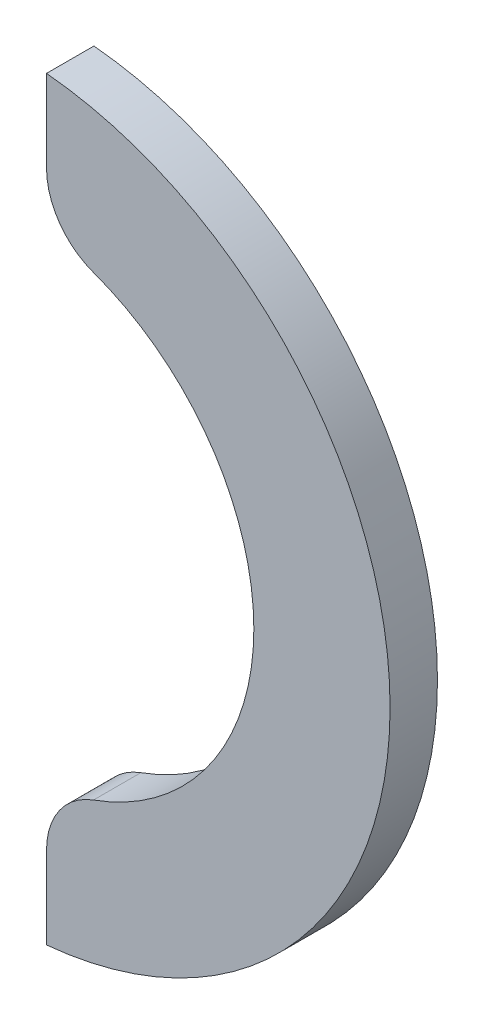
ISO-10303-21;
HEADER;
FILE_DESCRIPTION(('STEP AP214'),'2;1');
FILE_NAME('part.step','',(''),(''),'','','');
FILE_SCHEMA(('AUTOMOTIVE_DESIGN { 1 0 10303 214 1 1 1 1 }'));
ENDSEC;
DATA;
#1=APPLICATION_CONTEXT('core data for automotive mechanical design processes');
#2=APPLICATION_PROTOCOL_DEFINITION('international standard','automotive_design',2000,#1);
#3=PRODUCT_CONTEXT('',#1,'mechanical');
#4=PRODUCT('Part','Part','',(#3));
#5=PRODUCT_RELATED_PRODUCT_CATEGORY('part','',(#4));
#6=PRODUCT_DEFINITION_FORMATION('','',#4);
#7=PRODUCT_DEFINITION_CONTEXT('part definition',#1,'design');
#8=PRODUCT_DEFINITION('design','',#6,#7);
#9=PRODUCT_DEFINITION_SHAPE('','',#8);
#10=(LENGTH_UNIT() NAMED_UNIT(*) SI_UNIT(.MILLI.,.METRE.));
#11=(NAMED_UNIT(*) PLANE_ANGLE_UNIT() SI_UNIT($,.RADIAN.));
#12=(NAMED_UNIT(*) SI_UNIT($,.STERADIAN.) SOLID_ANGLE_UNIT());
#13=UNCERTAINTY_MEASURE_WITH_UNIT(LENGTH_MEASURE(1.E-05),#10,'distance_accuracy_value','');
#14=(GEOMETRIC_REPRESENTATION_CONTEXT(3) GLOBAL_UNCERTAINTY_ASSIGNED_CONTEXT((#13)) GLOBAL_UNIT_ASSIGNED_CONTEXT((#10,
#11,#12)) REPRESENTATION_CONTEXT('',''));
#15=CARTESIAN_POINT('',(0.,0.,0.));
#16=DIRECTION('',(0.,0.,1.));
#17=DIRECTION('',(1.,0.,0.));
#18=AXIS2_PLACEMENT_3D('',#15,#16,#17);
#19=CARTESIAN_POINT('',(0.,0.,2.));
#20=DIRECTION('',(0.,0.,1.));
#21=DIRECTION('',(1.,0.,0.));
#22=AXIS2_PLACEMENT_3D('',#19,#20,#21);
#23=PLANE('',#22);
#24=DIRECTION('',(0.,1.,0.));
#25=VECTOR('',#24,1.);
#26=CARTESIAN_POINT('',(1.5,0.,2.));
#27=LINE('',#26,#25);
#28=CARTESIAN_POINT('',(1.5,12.4624435806145,2.));
#29=VERTEX_POINT('',#28);
#30=CARTESIAN_POINT('',(1.5,15.929532322074,2.));
#31=VERTEX_POINT('',#30);
#32=EDGE_CURVE('E102',#29,#31,#27,.T.);
#33=ORIENTED_EDGE('',*,*,#32,.F.);
#34=CARTESIAN_POINT('',(4.5,12.4624435806145,2.));
#35=DIRECTION('',(0.,0.,1.));
#36=DIRECTION('',(1.,0.,0.));
#37=AXIS2_PLACEMENT_3D('',#34,#35,#36);
#38=CIRCLE('',#37,3.);
#39=CARTESIAN_POINT('',(3.4811320754717,9.64075824160746,2.));
#40=VERTEX_POINT('',#39);
#41=EDGE_CURVE('E141',#29,#40,#38,.T.);
#42=ORIENTED_EDGE('',*,*,#41,.T.);
#43=CARTESIAN_POINT('',(0.,0.,2.));
#44=DIRECTION('',(0.,0.,1.));
#45=DIRECTION('',(1.,0.,0.));
#46=AXIS2_PLACEMENT_3D('',#43,#44,#45);
#47=CIRCLE('',#46,10.25);
#48=CARTESIAN_POINT('',(3.4811320754717,-9.64075824160746,2.));
#49=VERTEX_POINT('',#48);
#50=EDGE_CURVE('E133',#49,#40,#47,.T.);
#51=ORIENTED_EDGE('',*,*,#50,.F.);
#52=CARTESIAN_POINT('',(4.5,-12.4624435806145,2.));
#53=DIRECTION('',(0.,0.,1.));
#54=DIRECTION('',(1.,0.,0.));
#55=AXIS2_PLACEMENT_3D('',#52,#53,#54);
#56=CIRCLE('',#55,3.);
#57=CARTESIAN_POINT('',(1.5,-12.4624435806145,2.));
#58=VERTEX_POINT('',#57);
#59=EDGE_CURVE('E131',#49,#58,#56,.T.);
#60=ORIENTED_EDGE('',*,*,#59,.T.);
#61=CARTESIAN_POINT('',(1.50000000000001,-15.929532322074,2.));
#62=VERTEX_POINT('',#61);
#63=EDGE_CURVE('E114',#62,#58,#27,.T.);
#64=ORIENTED_EDGE('',*,*,#63,.F.);
#65=CARTESIAN_POINT('',(0.,0.,2.));
#66=DIRECTION('',(0.,0.,1.));
#67=DIRECTION('',(1.,0.,0.));
#68=AXIS2_PLACEMENT_3D('',#65,#66,#67);
#69=CIRCLE('',#68,16.);
#70=EDGE_CURVE('E119',#62,#31,#69,.T.);
#71=ORIENTED_EDGE('',*,*,#70,.T.);
#72=EDGE_LOOP('',(#33,#42,#51,#60,#64,#71));
#73=FACE_BOUND('',#72,.T.);
#74=ADVANCED_FACE('F45',(#73),#23,.T.);
#75=CARTESIAN_POINT('',(0.,0.,0.));
#76=DIRECTION('',(0.,0.,1.));
#77=DIRECTION('',(1.,0.,0.));
#78=AXIS2_PLACEMENT_3D('',#75,#76,#77);
#79=PLANE('',#78);
#80=CARTESIAN_POINT('',(0.,0.,0.));
#81=DIRECTION('',(0.,0.,1.));
#82=DIRECTION('',(1.,0.,0.));
#83=AXIS2_PLACEMENT_3D('',#80,#81,#82);
#84=CIRCLE('',#83,10.25);
#85=CARTESIAN_POINT('',(3.4811320754717,-9.64075824160746,0.));
#86=VERTEX_POINT('',#85);
#87=CARTESIAN_POINT('',(3.4811320754717,9.64075824160746,0.));
#88=VERTEX_POINT('',#87);
#89=EDGE_CURVE('E136',#86,#88,#84,.T.);
#90=ORIENTED_EDGE('',*,*,#89,.T.);
#91=CARTESIAN_POINT('',(4.5,12.4624435806145,0.));
#92=DIRECTION('',(0.,0.,1.));
#93=DIRECTION('',(1.,0.,0.));
#94=AXIS2_PLACEMENT_3D('',#91,#92,#93);
#95=CIRCLE('',#94,3.);
#96=CARTESIAN_POINT('',(1.5,12.4624435806145,0.));
#97=VERTEX_POINT('',#96);
#98=EDGE_CURVE('E54',#88,#97,#95,.F.);
#99=ORIENTED_EDGE('',*,*,#98,.T.);
#100=DIRECTION('',(0.,1.,0.));
#101=VECTOR('',#100,1.);
#102=CARTESIAN_POINT('',(1.5,0.,0.));
#103=LINE('',#102,#101);
#104=CARTESIAN_POINT('',(1.5,15.929532322074,0.));
#105=VERTEX_POINT('',#104);
#106=EDGE_CURVE('E112',#97,#105,#103,.T.);
#107=ORIENTED_EDGE('',*,*,#106,.T.);
#108=CARTESIAN_POINT('',(0.,0.,0.));
#109=DIRECTION('',(0.,0.,1.));
#110=DIRECTION('',(1.,0.,0.));
#111=AXIS2_PLACEMENT_3D('',#108,#109,#110);
#112=CIRCLE('',#111,16.);
#113=CARTESIAN_POINT('',(1.50000000000001,-15.929532322074,0.));
#114=VERTEX_POINT('',#113);
#115=EDGE_CURVE('E122',#114,#105,#112,.T.);
#116=ORIENTED_EDGE('',*,*,#115,.F.);
#117=CARTESIAN_POINT('',(1.5,-12.4624435806145,0.));
#118=VERTEX_POINT('',#117);
#119=EDGE_CURVE('E124',#114,#118,#103,.T.);
#120=ORIENTED_EDGE('',*,*,#119,.T.);
#121=CARTESIAN_POINT('',(4.5,-12.4624435806145,0.));
#122=DIRECTION('',(0.,0.,1.));
#123=DIRECTION('',(1.,0.,0.));
#124=AXIS2_PLACEMENT_3D('',#121,#122,#123);
#125=CIRCLE('',#124,3.);
#126=EDGE_CURVE('E61',#118,#86,#125,.F.);
#127=ORIENTED_EDGE('',*,*,#126,.T.);
#128=EDGE_LOOP('',(#90,#99,#107,#116,#120,#127));
#129=FACE_BOUND('',#128,.T.);
#130=ADVANCED_FACE('F153',(#129),#79,.F.);
#131=CARTESIAN_POINT('',(0.,0.,2.));
#132=DIRECTION('',(0.,0.,-1.));
#133=DIRECTION('',(-1.,0.,0.));
#134=AXIS2_PLACEMENT_3D('',#131,#132,#133);
#135=CYLINDRICAL_SURFACE('',#134,16.);
#136=ORIENTED_EDGE('',*,*,#70,.F.);
#137=DIRECTION('',(0.,0.,-1.));
#138=VECTOR('',#137,1.);
#139=CARTESIAN_POINT('',(1.5,-15.929532322074,2.));
#140=LINE('',#139,#138);
#141=EDGE_CURVE('E163',#62,#114,#140,.T.);
#142=ORIENTED_EDGE('',*,*,#141,.T.);
#143=ORIENTED_EDGE('',*,*,#115,.T.);
#144=DIRECTION('',(0.,0.,-1.));
#145=VECTOR('',#144,1.);
#146=CARTESIAN_POINT('',(1.5,15.929532322074,2.));
#147=LINE('',#146,#145);
#148=EDGE_CURVE('E106',#105,#31,#147,.F.);
#149=ORIENTED_EDGE('',*,*,#148,.T.);
#150=EDGE_LOOP('',(#136,#142,#143,#149));
#151=FACE_BOUND('',#150,.T.);
#152=ADVANCED_FACE('F118',(#151),#135,.T.);
#153=CARTESIAN_POINT('',(0.,0.,2.));
#154=DIRECTION('',(0.,0.,-1.));
#155=DIRECTION('',(-1.,0.,0.));
#156=AXIS2_PLACEMENT_3D('',#153,#154,#155);
#157=CYLINDRICAL_SURFACE('',#156,10.25);
#158=ORIENTED_EDGE('',*,*,#50,.T.);
#159=DIRECTION('',(0.,0.,-1.));
#160=VECTOR('',#159,1.);
#161=CARTESIAN_POINT('',(3.4811320754717,9.64075824160746,2.));
#162=LINE('',#161,#160);
#163=EDGE_CURVE('E68',#40,#88,#162,.T.);
#164=ORIENTED_EDGE('',*,*,#163,.T.);
#165=ORIENTED_EDGE('',*,*,#89,.F.);
#166=DIRECTION('',(0.,0.,-1.));
#167=VECTOR('',#166,1.);
#168=CARTESIAN_POINT('',(3.4811320754717,-9.64075824160746,2.));
#169=LINE('',#168,#167);
#170=EDGE_CURVE('E144',#86,#49,#169,.F.);
#171=ORIENTED_EDGE('',*,*,#170,.T.);
#172=EDGE_LOOP('',(#158,#164,#165,#171));
#173=FACE_BOUND('',#172,.T.);
#174=ADVANCED_FACE('F160',(#173),#157,.F.);
#175=CARTESIAN_POINT('',(1.5,21.2065118825059,58.6237582645306));
#176=DIRECTION('',(1.,0.,0.));
#177=DIRECTION('',(0.,1.,0.));
#178=AXIS2_PLACEMENT_3D('',#175,#176,#177);
#179=PLANE('',#178);
#180=ORIENTED_EDGE('',*,*,#106,.F.);
#181=DIRECTION('',(0.,0.,1.));
#182=VECTOR('',#181,1.);
#183=CARTESIAN_POINT('',(1.5,12.4624435806145,2.));
#184=LINE('',#183,#182);
#185=EDGE_CURVE('E108',#97,#29,#184,.T.);
#186=ORIENTED_EDGE('',*,*,#185,.T.);
#187=ORIENTED_EDGE('',*,*,#32,.T.);
#188=ORIENTED_EDGE('',*,*,#148,.F.);
#189=EDGE_LOOP('',(#180,#186,#187,#188));
#190=FACE_BOUND('',#189,.T.);
#191=ADVANCED_FACE('F105',(#190),#179,.F.);
#192=ORIENTED_EDGE('',*,*,#63,.T.);
#193=DIRECTION('',(0.,0.,1.));
#194=VECTOR('',#193,1.);
#195=CARTESIAN_POINT('',(1.5,-12.4624435806145,0.));
#196=LINE('',#195,#194);
#197=EDGE_CURVE('E11',#58,#118,#196,.F.);
#198=ORIENTED_EDGE('',*,*,#197,.T.);
#199=ORIENTED_EDGE('',*,*,#119,.F.);
#200=ORIENTED_EDGE('',*,*,#141,.F.);
#201=EDGE_LOOP('',(#192,#198,#199,#200));
#202=FACE_BOUND('',#201,.T.);
#203=ADVANCED_FACE('F171',(#202),#179,.F.);
#204=CARTESIAN_POINT('',(4.5,12.4624435806145,2.));
#205=DIRECTION('',(0.,0.,-1.));
#206=DIRECTION('',(-1.,0.,0.));
#207=AXIS2_PLACEMENT_3D('',#204,#205,#206);
#208=CYLINDRICAL_SURFACE('',#207,3.);
#209=ORIENTED_EDGE('',*,*,#98,.F.);
#210=ORIENTED_EDGE('',*,*,#163,.F.);
#211=ORIENTED_EDGE('',*,*,#41,.F.);
#212=ORIENTED_EDGE('',*,*,#185,.F.);
#213=EDGE_LOOP('',(#209,#210,#211,#212));
#214=FACE_BOUND('',#213,.T.);
#215=ADVANCED_FACE('F157',(#214),#208,.T.);
#216=CARTESIAN_POINT('',(4.5,-12.4624435806145,2.));
#217=DIRECTION('',(0.,0.,-1.));
#218=DIRECTION('',(-1.,0.,0.));
#219=AXIS2_PLACEMENT_3D('',#216,#217,#218);
#220=CYLINDRICAL_SURFACE('',#219,3.);
#221=ORIENTED_EDGE('',*,*,#59,.F.);
#222=ORIENTED_EDGE('',*,*,#170,.F.);
#223=ORIENTED_EDGE('',*,*,#126,.F.);
#224=ORIENTED_EDGE('',*,*,#197,.F.);
#225=EDGE_LOOP('',(#221,#222,#223,#224));
#226=FACE_BOUND('',#225,.T.);
#227=ADVANCED_FACE('F47',(#226),#220,.T.);
#228=CLOSED_SHELL('',(#74,#130,#152,#174,#191,#203,#215,#227));
#229=MANIFOLD_SOLID_BREP('B2',#228);
#230=ADVANCED_BREP_SHAPE_REPRESENTATION('',(#18,#229),#14);
#231=SHAPE_DEFINITION_REPRESENTATION(#9,#230);
ENDSEC;
END-ISO-10303-21;
